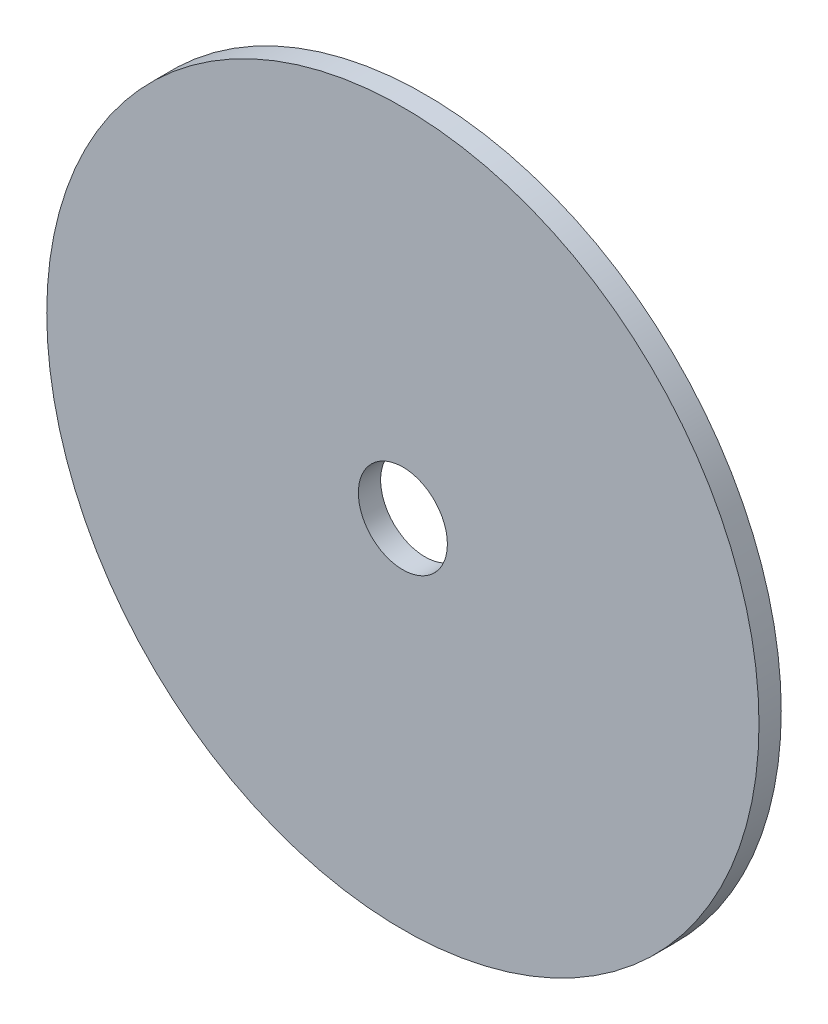
ISO-10303-21;
HEADER;
FILE_DESCRIPTION(('STEP AP214'),'2;1');
FILE_NAME('part.step','',(''),(''),'','','');
FILE_SCHEMA(('AUTOMOTIVE_DESIGN { 1 0 10303 214 1 1 1 1 }'));
ENDSEC;
DATA;
#1=APPLICATION_CONTEXT('core data for automotive mechanical design processes');
#2=APPLICATION_PROTOCOL_DEFINITION('international standard','automotive_design',2000,#1);
#3=PRODUCT_CONTEXT('',#1,'mechanical');
#4=PRODUCT('Part','Part','',(#3));
#5=PRODUCT_RELATED_PRODUCT_CATEGORY('part','',(#4));
#6=PRODUCT_DEFINITION_FORMATION('','',#4);
#7=PRODUCT_DEFINITION_CONTEXT('part definition',#1,'design');
#8=PRODUCT_DEFINITION('design','',#6,#7);
#9=PRODUCT_DEFINITION_SHAPE('','',#8);
#10=(LENGTH_UNIT() NAMED_UNIT(*) SI_UNIT(.MILLI.,.METRE.));
#11=(NAMED_UNIT(*) PLANE_ANGLE_UNIT() SI_UNIT($,.RADIAN.));
#12=(NAMED_UNIT(*) SI_UNIT($,.STERADIAN.) SOLID_ANGLE_UNIT());
#13=UNCERTAINTY_MEASURE_WITH_UNIT(LENGTH_MEASURE(1.E-05),#10,'distance_accuracy_value','');
#14=(GEOMETRIC_REPRESENTATION_CONTEXT(3) GLOBAL_UNCERTAINTY_ASSIGNED_CONTEXT((#13)) GLOBAL_UNIT_ASSIGNED_CONTEXT((#10,
#11,#12)) REPRESENTATION_CONTEXT('',''));
#15=CARTESIAN_POINT('',(0.,0.,0.));
#16=DIRECTION('',(0.,0.,1.));
#17=DIRECTION('',(1.,0.,0.));
#18=AXIS2_PLACEMENT_3D('',#15,#16,#17);
#19=CARTESIAN_POINT('',(0.,0.,3.175));
#20=DIRECTION('',(0.,0.,1.));
#21=DIRECTION('',(1.,0.,0.));
#22=AXIS2_PLACEMENT_3D('',#19,#20,#21);
#23=PLANE('',#22);
#24=CARTESIAN_POINT('',(0.,0.,3.175));
#25=DIRECTION('',(0.,0.,1.));
#26=DIRECTION('',(1.,0.,0.));
#27=AXIS2_PLACEMENT_3D('',#24,#25,#26);
#28=CIRCLE('',#27,50.8);
#29=CARTESIAN_POINT('',(50.8,0.,3.175));
#30=VERTEX_POINT('',#29);
#31=EDGE_CURVE('E10',#30,#30,#28,.T.);
#32=ORIENTED_EDGE('',*,*,#31,.T.);
#33=EDGE_LOOP('',(#32));
#34=FACE_BOUND('',#33,.T.);
#35=CARTESIAN_POINT('',(0.,0.,3.175));
#36=DIRECTION('',(0.,0.,1.));
#37=DIRECTION('',(1.,0.,0.));
#38=AXIS2_PLACEMENT_3D('',#35,#36,#37);
#39=CIRCLE('',#38,6.35);
#40=CARTESIAN_POINT('',(6.35,0.,3.175));
#41=VERTEX_POINT('',#40);
#42=EDGE_CURVE('E42',#41,#41,#39,.T.);
#43=ORIENTED_EDGE('',*,*,#42,.F.);
#44=EDGE_LOOP('',(#43));
#45=FACE_BOUND('',#44,.T.);
#46=ADVANCED_FACE('F31',(#34,#45),#23,.T.);
#47=CARTESIAN_POINT('',(0.,0.,0.));
#48=DIRECTION('',(0.,0.,1.));
#49=DIRECTION('',(1.,0.,0.));
#50=AXIS2_PLACEMENT_3D('',#47,#48,#49);
#51=PLANE('',#50);
#52=CARTESIAN_POINT('',(0.,0.,0.));
#53=DIRECTION('',(0.,0.,1.));
#54=DIRECTION('',(1.,0.,0.));
#55=AXIS2_PLACEMENT_3D('',#52,#53,#54);
#56=CIRCLE('',#55,50.8);
#57=CARTESIAN_POINT('',(50.8,0.,0.));
#58=VERTEX_POINT('',#57);
#59=EDGE_CURVE('E35',#58,#58,#56,.T.);
#60=ORIENTED_EDGE('',*,*,#59,.F.);
#61=EDGE_LOOP('',(#60));
#62=FACE_BOUND('',#61,.T.);
#63=CARTESIAN_POINT('',(0.,0.,0.));
#64=DIRECTION('',(0.,0.,1.));
#65=DIRECTION('',(1.,0.,0.));
#66=AXIS2_PLACEMENT_3D('',#63,#64,#65);
#67=CIRCLE('',#66,6.35);
#68=CARTESIAN_POINT('',(6.35,0.,0.));
#69=VERTEX_POINT('',#68);
#70=EDGE_CURVE('E44',#69,#69,#67,.T.);
#71=ORIENTED_EDGE('',*,*,#70,.T.);
#72=EDGE_LOOP('',(#71));
#73=FACE_BOUND('',#72,.T.);
#74=ADVANCED_FACE('F54',(#62,#73),#51,.F.);
#75=CARTESIAN_POINT('',(0.,0.,3.175));
#76=DIRECTION('',(0.,0.,-1.));
#77=DIRECTION('',(-1.,0.,0.));
#78=AXIS2_PLACEMENT_3D('',#75,#76,#77);
#79=CYLINDRICAL_SURFACE('',#78,50.8);
#80=ORIENTED_EDGE('',*,*,#31,.F.);
#81=EDGE_LOOP('',(#80));
#82=FACE_BOUND('',#81,.T.);
#83=ORIENTED_EDGE('',*,*,#59,.T.);
#84=EDGE_LOOP('',(#83));
#85=FACE_BOUND('',#84,.T.);
#86=ADVANCED_FACE('F33',(#82,#85),#79,.T.);
#87=CARTESIAN_POINT('',(0.,0.,3.175));
#88=DIRECTION('',(0.,0.,-1.));
#89=DIRECTION('',(-1.,0.,0.));
#90=AXIS2_PLACEMENT_3D('',#87,#88,#89);
#91=CYLINDRICAL_SURFACE('',#90,6.35);
#92=ORIENTED_EDGE('',*,*,#42,.T.);
#93=EDGE_LOOP('',(#92));
#94=FACE_BOUND('',#93,.T.);
#95=ORIENTED_EDGE('',*,*,#70,.F.);
#96=EDGE_LOOP('',(#95));
#97=FACE_BOUND('',#96,.T.);
#98=ADVANCED_FACE('F50',(#94,#97),#91,.F.);
#99=CLOSED_SHELL('',(#46,#74,#86,#98));
#100=MANIFOLD_SOLID_BREP('B2',#99);
#101=ADVANCED_BREP_SHAPE_REPRESENTATION('',(#18,#100),#14);
#102=SHAPE_DEFINITION_REPRESENTATION(#9,#101);
ENDSEC;
END-ISO-10303-21;
